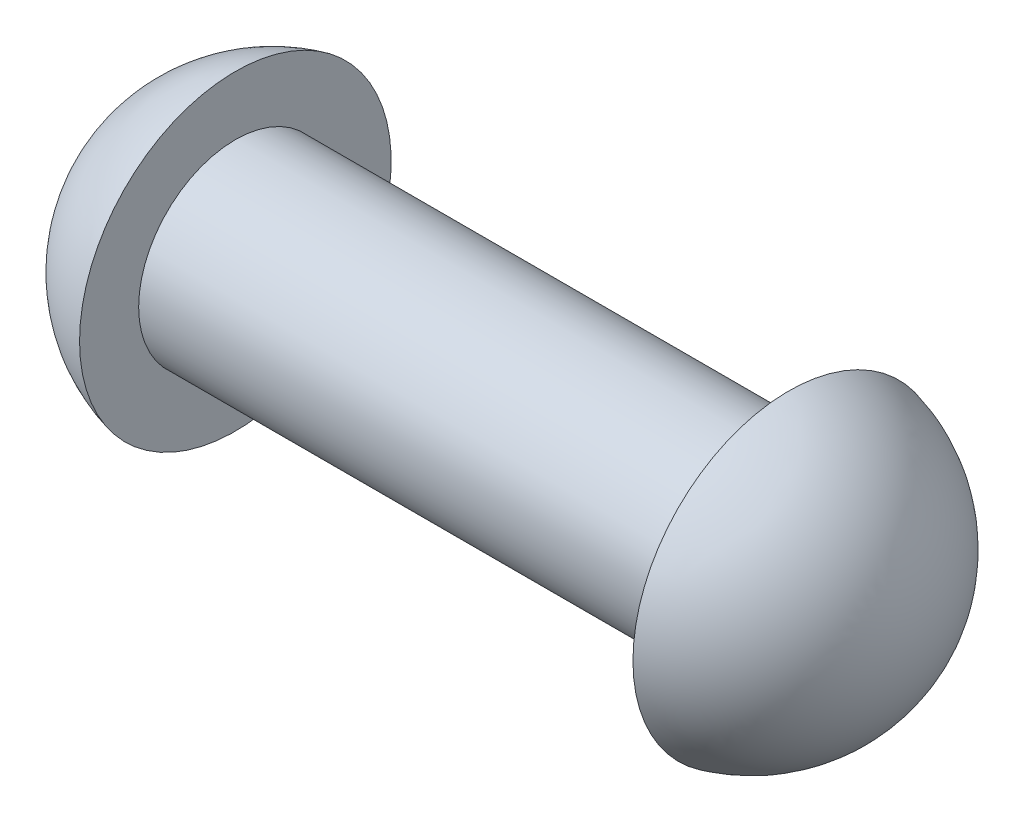
ISO-10303-21;
HEADER;
FILE_DESCRIPTION(('STEP AP214'),'2;1');
FILE_NAME('part.step','',(''),(''),'','','');
FILE_SCHEMA(('AUTOMOTIVE_DESIGN { 1 0 10303 214 1 1 1 1 }'));
ENDSEC;
DATA;
#1=APPLICATION_CONTEXT('core data for automotive mechanical design processes');
#2=APPLICATION_PROTOCOL_DEFINITION('international standard','automotive_design',2000,#1);
#3=PRODUCT_CONTEXT('',#1,'mechanical');
#4=PRODUCT('Part','Part','',(#3));
#5=PRODUCT_RELATED_PRODUCT_CATEGORY('part','',(#4));
#6=PRODUCT_DEFINITION_FORMATION('','',#4);
#7=PRODUCT_DEFINITION_CONTEXT('part definition',#1,'design');
#8=PRODUCT_DEFINITION('design','',#6,#7);
#9=PRODUCT_DEFINITION_SHAPE('','',#8);
#10=(LENGTH_UNIT() NAMED_UNIT(*) SI_UNIT(.MILLI.,.METRE.));
#11=(NAMED_UNIT(*) PLANE_ANGLE_UNIT() SI_UNIT($,.RADIAN.));
#12=(NAMED_UNIT(*) SI_UNIT($,.STERADIAN.) SOLID_ANGLE_UNIT());
#13=UNCERTAINTY_MEASURE_WITH_UNIT(LENGTH_MEASURE(1.E-05),#10,'distance_accuracy_value','');
#14=(GEOMETRIC_REPRESENTATION_CONTEXT(3) GLOBAL_UNCERTAINTY_ASSIGNED_CONTEXT((#13)) GLOBAL_UNIT_ASSIGNED_CONTEXT((#10,
#11,#12)) REPRESENTATION_CONTEXT('',''));
#15=CARTESIAN_POINT('',(0.,0.,0.));
#16=DIRECTION('',(0.,0.,1.));
#17=DIRECTION('',(1.,0.,0.));
#18=AXIS2_PLACEMENT_3D('',#15,#16,#17);
#19=CARTESIAN_POINT('',(-138.,0.,0.));
#20=DIRECTION('',(-1.,0.,0.));
#21=DIRECTION('',(0.,0.,1.));
#22=AXIS2_PLACEMENT_3D('',#19,#20,#21);
#23=CYLINDRICAL_SURFACE('',#22,18.);
#24=CARTESIAN_POINT('',(-103.,0.,0.));
#25=DIRECTION('',(-1.,0.,0.));
#26=DIRECTION('',(0.,0.,1.));
#27=AXIS2_PLACEMENT_3D('',#24,#25,#26);
#28=CIRCLE('',#27,18.);
#29=CARTESIAN_POINT('',(-103.,0.,18.));
#30=VERTEX_POINT('',#29);
#31=EDGE_CURVE('E11',#30,#30,#28,.T.);
#32=ORIENTED_EDGE('',*,*,#31,.F.);
#33=EDGE_LOOP('',(#32));
#34=FACE_BOUND('',#33,.T.);
#35=CARTESIAN_POINT('',(0.,0.,0.));
#36=DIRECTION('',(1.,0.,0.));
#37=DIRECTION('',(0.,0.,-1.));
#38=AXIS2_PLACEMENT_3D('',#35,#36,#37);
#39=CIRCLE('',#38,18.);
#40=CARTESIAN_POINT('',(0.,0.,-18.));
#41=VERTEX_POINT('',#40);
#42=EDGE_CURVE('E68',#41,#41,#39,.T.);
#43=ORIENTED_EDGE('',*,*,#42,.F.);
#44=EDGE_LOOP('',(#43));
#45=FACE_BOUND('',#44,.T.);
#46=ADVANCED_FACE('F32',(#34,#45),#23,.T.);
#47=CARTESIAN_POINT('',(-103.,18.,0.));
#48=DIRECTION('',(-1.,0.,0.));
#49=DIRECTION('',(0.,0.,1.));
#50=AXIS2_PLACEMENT_3D('',#47,#48,#49);
#51=PLANE('',#50);
#52=CARTESIAN_POINT('',(-103.,0.,0.));
#53=DIRECTION('',(-1.,0.,0.));
#54=DIRECTION('',(0.,0.,1.));
#55=AXIS2_PLACEMENT_3D('',#52,#53,#54);
#56=CIRCLE('',#55,29.);
#57=CARTESIAN_POINT('',(-103.,0.,29.));
#58=VERTEX_POINT('',#57);
#59=EDGE_CURVE('E39',#58,#58,#56,.T.);
#60=ORIENTED_EDGE('',*,*,#59,.F.);
#61=EDGE_LOOP('',(#60));
#62=FACE_BOUND('',#61,.T.);
#63=ORIENTED_EDGE('',*,*,#31,.T.);
#64=EDGE_LOOP('',(#63));
#65=FACE_BOUND('',#64,.T.);
#66=ADVANCED_FACE('F58',(#62,#65),#51,.F.);
#67=CARTESIAN_POINT('',(-96.0004932004981,0.,-0.172022634087729));
#68=DIRECTION('',(0.,-1.,0.));
#69=DIRECTION('',(0.,0.,1.));
#70=AXIS2_PLACEMENT_3D('',#67,#68,#69);
#71=CIRCLE('',#70,30.);
#72=TRIMMED_CURVE('',#71,(PARAMETER_VALUE(-1.56506220756893)),
(PARAMETER_VALUE(1.56506220756893)),.T.,.PARAMETER.);
#73=CARTESIAN_POINT('',(-96.0004932004981,0.,0.));
#74=DIRECTION('',(-1.,0.,0.));
#75=AXIS1_PLACEMENT('',#73,#74);
#76=SURFACE_OF_REVOLUTION('',#72,#75);
#77=CARTESIAN_POINT('',(-126.,0.,0.));
#78=VERTEX_POINT('',#77);
#79=VERTEX_LOOP('',#78);
#80=FACE_BOUND('',#79,.T.);
#81=ORIENTED_EDGE('',*,*,#59,.T.);
#82=EDGE_LOOP('',(#81));
#83=FACE_BOUND('',#82,.T.);
#84=ADVANCED_FACE('F53',(#80,#83),#76,.T.);
#85=CARTESIAN_POINT('',(0.,0.,0.));
#86=DIRECTION('',(1.,0.,0.));
#87=DIRECTION('',(0.,0.,-1.));
#88=AXIS2_PLACEMENT_3D('',#85,#86,#87);
#89=PLANE('',#88);
#90=ORIENTED_EDGE('',*,*,#42,.T.);
#91=EDGE_LOOP('',(#90));
#92=FACE_BOUND('',#91,.T.);
#93=CARTESIAN_POINT('',(0.,0.,0.));
#94=DIRECTION('',(-1.,0.,0.));
#95=DIRECTION('',(0.,0.,1.));
#96=AXIS2_PLACEMENT_3D('',#93,#94,#95);
#97=CIRCLE('',#96,29.);
#98=CARTESIAN_POINT('',(0.,0.,29.));
#99=VERTEX_POINT('',#98);
#100=EDGE_CURVE('E69',#99,#99,#97,.T.);
#101=ORIENTED_EDGE('',*,*,#100,.T.);
#102=EDGE_LOOP('',(#101));
#103=FACE_BOUND('',#102,.T.);
#104=ADVANCED_FACE('F47',(#92,#103),#89,.F.);
#105=CARTESIAN_POINT('',(-6.99950679950191,0.,-0.172022634087724));
#106=DIRECTION('',(0.,-1.,0.));
#107=DIRECTION('',(0.,0.,1.));
#108=AXIS2_PLACEMENT_3D('',#105,#106,#107);
#109=CIRCLE('',#108,30.);
#110=TRIMMED_CURVE('',#109,(PARAMETER_VALUE(-1.56506220756893)),
(PARAMETER_VALUE(1.56506220756893)),.T.,.PARAMETER.);
#111=CARTESIAN_POINT('',(-6.99950679950191,0.,0.));
#112=DIRECTION('',(-1.,0.,0.));
#113=AXIS1_PLACEMENT('',#111,#112);
#114=SURFACE_OF_REVOLUTION('',#110,#113);
#115=ORIENTED_EDGE('',*,*,#100,.F.);
#116=EDGE_LOOP('',(#115));
#117=FACE_BOUND('',#116,.T.);
#118=CARTESIAN_POINT('',(23.,0.,0.));
#119=VERTEX_POINT('',#118);
#120=VERTEX_LOOP('',#119);
#121=FACE_BOUND('',#120,.T.);
#122=ADVANCED_FACE('F45',(#117,#121),#114,.T.);
#123=CLOSED_SHELL('',(#46,#66,#84,#104,#122));
#124=MANIFOLD_SOLID_BREP('B2',#123);
#125=ADVANCED_BREP_SHAPE_REPRESENTATION('',(#18,#124),#14);
#126=SHAPE_DEFINITION_REPRESENTATION(#9,#125);
ENDSEC;
END-ISO-10303-21;
